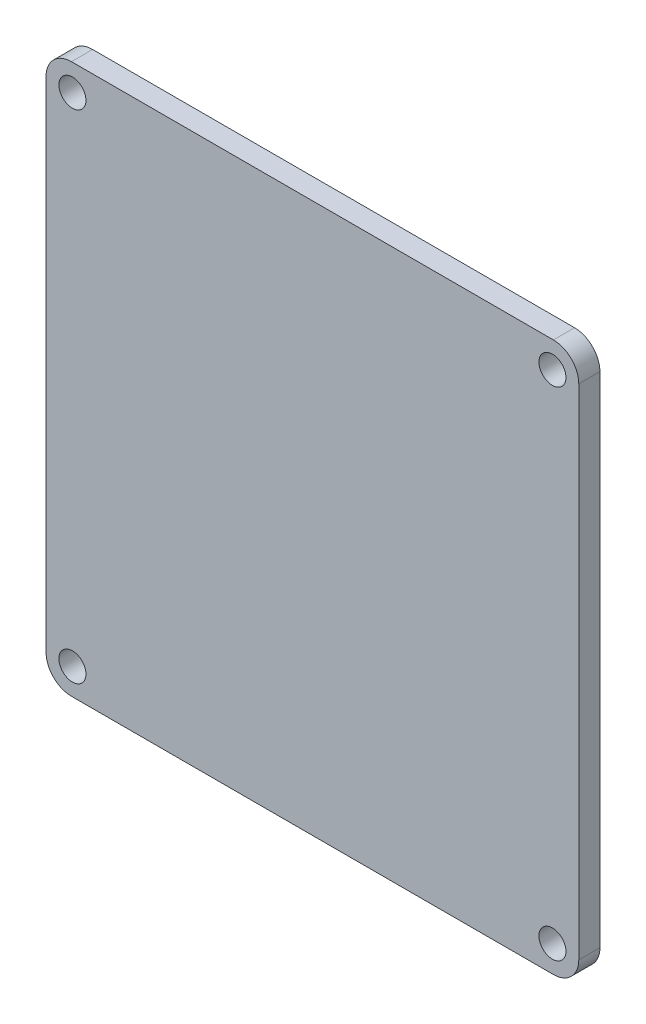
ISO-10303-21;
HEADER;
FILE_DESCRIPTION(('STEP AP214'),'2;1');
FILE_NAME('part.step','',(''),(''),'','','');
FILE_SCHEMA(('AUTOMOTIVE_DESIGN { 1 0 10303 214 1 1 1 1 }'));
ENDSEC;
DATA;
#1=APPLICATION_CONTEXT('core data for automotive mechanical design processes');
#2=APPLICATION_PROTOCOL_DEFINITION('international standard','automotive_design',2000,#1);
#3=PRODUCT_CONTEXT('',#1,'mechanical');
#4=PRODUCT('Part','Part','',(#3));
#5=PRODUCT_RELATED_PRODUCT_CATEGORY('part','',(#4));
#6=PRODUCT_DEFINITION_FORMATION('','',#4);
#7=PRODUCT_DEFINITION_CONTEXT('part definition',#1,'design');
#8=PRODUCT_DEFINITION('design','',#6,#7);
#9=PRODUCT_DEFINITION_SHAPE('','',#8);
#10=(LENGTH_UNIT() NAMED_UNIT(*) SI_UNIT(.MILLI.,.METRE.));
#11=(NAMED_UNIT(*) PLANE_ANGLE_UNIT() SI_UNIT($,.RADIAN.));
#12=(NAMED_UNIT(*) SI_UNIT($,.STERADIAN.) SOLID_ANGLE_UNIT());
#13=UNCERTAINTY_MEASURE_WITH_UNIT(LENGTH_MEASURE(1.E-05),#10,'distance_accuracy_value','');
#14=(GEOMETRIC_REPRESENTATION_CONTEXT(3) GLOBAL_UNCERTAINTY_ASSIGNED_CONTEXT((#13)) GLOBAL_UNIT_ASSIGNED_CONTEXT((#10,
#11,#12)) REPRESENTATION_CONTEXT('',''));
#15=CARTESIAN_POINT('',(0.,0.,0.));
#16=DIRECTION('',(0.,0.,1.));
#17=DIRECTION('',(1.,0.,0.));
#18=AXIS2_PLACEMENT_3D('',#15,#16,#17);
#19=CARTESIAN_POINT('',(0.,0.,2.5));
#20=DIRECTION('',(0.,1.,0.));
#21=DIRECTION('',(-1.,0.,0.));
#22=AXIS2_PLACEMENT_3D('',#19,#20,#21);
#23=PLANE('',#22);
#24=DIRECTION('',(1.,0.,0.));
#25=VECTOR('',#24,1.);
#26=CARTESIAN_POINT('',(0.,0.,2.5));
#27=LINE('',#26,#25);
#28=CARTESIAN_POINT('',(3.,0.,2.5));
#29=VERTEX_POINT('',#28);
#30=CARTESIAN_POINT('',(60.,0.,2.5));
#31=VERTEX_POINT('',#30);
#32=EDGE_CURVE('E152',#29,#31,#27,.T.);
#33=ORIENTED_EDGE('',*,*,#32,.F.);
#34=DIRECTION('',(0.,0.,-1.));
#35=VECTOR('',#34,1.);
#36=CARTESIAN_POINT('',(3.,0.,0.));
#37=LINE('',#36,#35);
#38=CARTESIAN_POINT('',(3.,0.,0.));
#39=VERTEX_POINT('',#38);
#40=EDGE_CURVE('E11',#29,#39,#37,.T.);
#41=ORIENTED_EDGE('',*,*,#40,.T.);
#42=DIRECTION('',(1.,0.,0.));
#43=VECTOR('',#42,1.);
#44=CARTESIAN_POINT('',(0.,0.,0.));
#45=LINE('',#44,#43);
#46=CARTESIAN_POINT('',(60.,0.,0.));
#47=VERTEX_POINT('',#46);
#48=EDGE_CURVE('E155',#39,#47,#45,.T.);
#49=ORIENTED_EDGE('',*,*,#48,.T.);
#50=DIRECTION('',(0.,0.,-1.));
#51=VECTOR('',#50,1.);
#52=CARTESIAN_POINT('',(60.,0.,2.5));
#53=LINE('',#52,#51);
#54=EDGE_CURVE('E41',#47,#31,#53,.F.);
#55=ORIENTED_EDGE('',*,*,#54,.T.);
#56=EDGE_LOOP('',(#33,#41,#49,#55));
#57=FACE_BOUND('',#56,.T.);
#58=ADVANCED_FACE('F33',(#57),#23,.F.);
#59=CARTESIAN_POINT('',(63.,0.,2.5));
#60=DIRECTION('',(-1.,0.,0.));
#61=DIRECTION('',(0.,0.,1.));
#62=AXIS2_PLACEMENT_3D('',#59,#60,#61);
#63=PLANE('',#62);
#64=DIRECTION('',(0.,1.,0.));
#65=VECTOR('',#64,1.);
#66=CARTESIAN_POINT('',(63.,0.,0.));
#67=LINE('',#66,#65);
#68=CARTESIAN_POINT('',(63.,3.00000000000001,0.));
#69=VERTEX_POINT('',#68);
#70=CARTESIAN_POINT('',(63.,62.,0.));
#71=VERTEX_POINT('',#70);
#72=EDGE_CURVE('E119',#69,#71,#67,.T.);
#73=ORIENTED_EDGE('',*,*,#72,.T.);
#74=DIRECTION('',(0.,0.,-1.));
#75=VECTOR('',#74,1.);
#76=CARTESIAN_POINT('',(63.,62.,2.5));
#77=LINE('',#76,#75);
#78=CARTESIAN_POINT('',(63.,62.,2.5));
#79=VERTEX_POINT('',#78);
#80=EDGE_CURVE('E136',#71,#79,#77,.F.);
#81=ORIENTED_EDGE('',*,*,#80,.T.);
#82=DIRECTION('',(0.,1.,0.));
#83=VECTOR('',#82,1.);
#84=CARTESIAN_POINT('',(63.,0.,2.5));
#85=LINE('',#84,#83);
#86=CARTESIAN_POINT('',(63.,3.00000000000001,2.5));
#87=VERTEX_POINT('',#86);
#88=EDGE_CURVE('E162',#87,#79,#85,.T.);
#89=ORIENTED_EDGE('',*,*,#88,.F.);
#90=DIRECTION('',(0.,0.,-1.));
#91=VECTOR('',#90,1.);
#92=CARTESIAN_POINT('',(63.,3.00000000000001,2.5));
#93=LINE('',#92,#91);
#94=EDGE_CURVE('E133',#87,#69,#93,.T.);
#95=ORIENTED_EDGE('',*,*,#94,.T.);
#96=EDGE_LOOP('',(#73,#81,#89,#95));
#97=FACE_BOUND('',#96,.T.);
#98=ADVANCED_FACE('F168',(#97),#63,.F.);
#99=CARTESIAN_POINT('',(0.,65.,2.5));
#100=DIRECTION('',(0.,1.,0.));
#101=DIRECTION('',(0.,0.,1.));
#102=AXIS2_PLACEMENT_3D('',#99,#100,#101);
#103=PLANE('',#102);
#104=DIRECTION('',(1.,0.,0.));
#105=VECTOR('',#104,1.);
#106=CARTESIAN_POINT('',(0.,65.,2.5));
#107=LINE('',#106,#105);
#108=CARTESIAN_POINT('',(3.00000000000002,65.,2.5));
#109=VERTEX_POINT('',#108);
#110=CARTESIAN_POINT('',(60.,65.,2.5));
#111=VERTEX_POINT('',#110);
#112=EDGE_CURVE('E126',#109,#111,#107,.T.);
#113=ORIENTED_EDGE('',*,*,#112,.T.);
#114=DIRECTION('',(0.,0.,-1.));
#115=VECTOR('',#114,1.);
#116=CARTESIAN_POINT('',(60.,65.,0.));
#117=LINE('',#116,#115);
#118=CARTESIAN_POINT('',(60.,65.,0.));
#119=VERTEX_POINT('',#118);
#120=EDGE_CURVE('E118',#111,#119,#117,.T.);
#121=ORIENTED_EDGE('',*,*,#120,.T.);
#122=DIRECTION('',(1.,0.,0.));
#123=VECTOR('',#122,1.);
#124=CARTESIAN_POINT('',(0.,65.,0.));
#125=LINE('',#124,#123);
#126=CARTESIAN_POINT('',(3.00000000000002,65.,0.));
#127=VERTEX_POINT('',#126);
#128=EDGE_CURVE('E103',#127,#119,#125,.T.);
#129=ORIENTED_EDGE('',*,*,#128,.F.);
#130=DIRECTION('',(0.,0.,-1.));
#131=VECTOR('',#130,1.);
#132=CARTESIAN_POINT('',(3.00000000000002,65.,2.5));
#133=LINE('',#132,#131);
#134=EDGE_CURVE('E116',#127,#109,#133,.F.);
#135=ORIENTED_EDGE('',*,*,#134,.T.);
#136=EDGE_LOOP('',(#113,#121,#129,#135));
#137=FACE_BOUND('',#136,.T.);
#138=ADVANCED_FACE('F115',(#137),#103,.T.);
#139=CARTESIAN_POINT('',(0.,0.,2.5));
#140=DIRECTION('',(-1.,0.,0.));
#141=DIRECTION('',(0.,-1.,0.));
#142=AXIS2_PLACEMENT_3D('',#139,#140,#141);
#143=PLANE('',#142);
#144=DIRECTION('',(0.,1.,0.));
#145=VECTOR('',#144,1.);
#146=CARTESIAN_POINT('',(0.,0.,2.5));
#147=LINE('',#146,#145);
#148=CARTESIAN_POINT('',(0.,3.,2.5));
#149=VERTEX_POINT('',#148);
#150=CARTESIAN_POINT('',(0.,62.,2.5));
#151=VERTEX_POINT('',#150);
#152=EDGE_CURVE('E122',#149,#151,#147,.T.);
#153=ORIENTED_EDGE('',*,*,#152,.T.);
#154=DIRECTION('',(0.,0.,-1.));
#155=VECTOR('',#154,1.);
#156=CARTESIAN_POINT('',(0.,62.,2.5));
#157=LINE('',#156,#155);
#158=CARTESIAN_POINT('',(0.,62.,0.));
#159=VERTEX_POINT('',#158);
#160=EDGE_CURVE('E146',#151,#159,#157,.T.);
#161=ORIENTED_EDGE('',*,*,#160,.T.);
#162=DIRECTION('',(0.,1.,0.));
#163=VECTOR('',#162,1.);
#164=CARTESIAN_POINT('',(0.,0.,0.));
#165=LINE('',#164,#163);
#166=CARTESIAN_POINT('',(0.,3.,0.));
#167=VERTEX_POINT('',#166);
#168=EDGE_CURVE('E104',#167,#159,#165,.T.);
#169=ORIENTED_EDGE('',*,*,#168,.F.);
#170=DIRECTION('',(0.,0.,-1.));
#171=VECTOR('',#170,1.);
#172=CARTESIAN_POINT('',(0.,3.,2.5));
#173=LINE('',#172,#171);
#174=EDGE_CURVE('E55',#167,#149,#173,.F.);
#175=ORIENTED_EDGE('',*,*,#174,.T.);
#176=EDGE_LOOP('',(#153,#161,#169,#175));
#177=FACE_BOUND('',#176,.T.);
#178=ADVANCED_FACE('F236',(#177),#143,.T.);
#179=CARTESIAN_POINT('',(0.,0.,2.5));
#180=DIRECTION('',(0.,0.,1.));
#181=DIRECTION('',(1.,0.,0.));
#182=AXIS2_PLACEMENT_3D('',#179,#180,#181);
#183=PLANE('',#182);
#184=CARTESIAN_POINT('',(59.8844963488532,61.8844963488532,2.5));
#185=DIRECTION('',(0.,0.,1.));
#186=DIRECTION('',(1.,0.,0.));
#187=AXIS2_PLACEMENT_3D('',#184,#185,#186);
#188=CIRCLE('',#187,1.6);
#189=CARTESIAN_POINT('',(61.4844963488532,61.8844963488532,2.5));
#190=VERTEX_POINT('',#189);
#191=EDGE_CURVE('E182',#190,#190,#188,.T.);
#192=ORIENTED_EDGE('',*,*,#191,.F.);
#193=EDGE_LOOP('',(#192));
#194=FACE_BOUND('',#193,.T.);
#195=CARTESIAN_POINT('',(59.8844963488532,3.1155036511468,2.5));
#196=DIRECTION('',(0.,0.,1.));
#197=DIRECTION('',(1.,0.,0.));
#198=AXIS2_PLACEMENT_3D('',#195,#196,#197);
#199=CIRCLE('',#198,1.6);
#200=CARTESIAN_POINT('',(61.4844963488532,3.1155036511468,2.5));
#201=VERTEX_POINT('',#200);
#202=EDGE_CURVE('E188',#201,#201,#199,.T.);
#203=ORIENTED_EDGE('',*,*,#202,.F.);
#204=EDGE_LOOP('',(#203));
#205=FACE_BOUND('',#204,.T.);
#206=CARTESIAN_POINT('',(3.1155036511468,3.1155036511468,2.5));
#207=DIRECTION('',(0.,0.,1.));
#208=DIRECTION('',(1.,0.,0.));
#209=AXIS2_PLACEMENT_3D('',#206,#207,#208);
#210=CIRCLE('',#209,1.6);
#211=CARTESIAN_POINT('',(4.7155036511468,3.1155036511468,2.5));
#212=VERTEX_POINT('',#211);
#213=EDGE_CURVE('E194',#212,#212,#210,.T.);
#214=ORIENTED_EDGE('',*,*,#213,.F.);
#215=EDGE_LOOP('',(#214));
#216=FACE_BOUND('',#215,.T.);
#217=CARTESIAN_POINT('',(3.1155036511468,61.8844963488532,2.5));
#218=DIRECTION('',(0.,0.,1.));
#219=DIRECTION('',(1.,0.,0.));
#220=AXIS2_PLACEMENT_3D('',#217,#218,#219);
#221=CIRCLE('',#220,1.6);
#222=CARTESIAN_POINT('',(4.7155036511468,61.8844963488532,2.5));
#223=VERTEX_POINT('',#222);
#224=EDGE_CURVE('E171',#223,#223,#221,.T.);
#225=ORIENTED_EDGE('',*,*,#224,.F.);
#226=EDGE_LOOP('',(#225));
#227=FACE_BOUND('',#226,.T.);
#228=ORIENTED_EDGE('',*,*,#88,.T.);
#229=CARTESIAN_POINT('',(60.,62.,2.5));
#230=DIRECTION('',(0.,0.,1.));
#231=DIRECTION('',(1.,0.,0.));
#232=AXIS2_PLACEMENT_3D('',#229,#230,#231);
#233=CIRCLE('',#232,3.);
#234=EDGE_CURVE('E143',#79,#111,#233,.T.);
#235=ORIENTED_EDGE('',*,*,#234,.T.);
#236=ORIENTED_EDGE('',*,*,#112,.F.);
#237=CARTESIAN_POINT('',(3.00000000000002,62.,2.5));
#238=DIRECTION('',(0.,0.,1.));
#239=DIRECTION('',(1.,0.,0.));
#240=AXIS2_PLACEMENT_3D('',#237,#238,#239);
#241=CIRCLE('',#240,3.);
#242=EDGE_CURVE('E48',#109,#151,#241,.T.);
#243=ORIENTED_EDGE('',*,*,#242,.T.);
#244=ORIENTED_EDGE('',*,*,#152,.F.);
#245=CARTESIAN_POINT('',(3.,3.,2.5));
#246=DIRECTION('',(0.,0.,1.));
#247=DIRECTION('',(1.,0.,0.));
#248=AXIS2_PLACEMENT_3D('',#245,#246,#247);
#249=CIRCLE('',#248,3.);
#250=EDGE_CURVE('E140',#149,#29,#249,.T.);
#251=ORIENTED_EDGE('',*,*,#250,.T.);
#252=ORIENTED_EDGE('',*,*,#32,.T.);
#253=CARTESIAN_POINT('',(60.,3.00000000000001,2.5));
#254=DIRECTION('',(0.,0.,1.));
#255=DIRECTION('',(1.,0.,0.));
#256=AXIS2_PLACEMENT_3D('',#253,#254,#255);
#257=CIRCLE('',#256,3.);
#258=EDGE_CURVE('E138',#31,#87,#257,.T.);
#259=ORIENTED_EDGE('',*,*,#258,.T.);
#260=EDGE_LOOP('',(#228,#235,#236,#243,#244,#251,#252,#259));
#261=FACE_BOUND('',#260,.T.);
#262=ADVANCED_FACE('F159',(#194,#205,#216,#227,#261),#183,.T.);
#263=CARTESIAN_POINT('',(0.,0.,0.));
#264=DIRECTION('',(0.,0.,1.));
#265=DIRECTION('',(1.,0.,0.));
#266=AXIS2_PLACEMENT_3D('',#263,#264,#265);
#267=PLANE('',#266);
#268=CARTESIAN_POINT('',(59.8844963488532,61.8844963488532,0.));
#269=DIRECTION('',(0.,0.,1.));
#270=DIRECTION('',(1.,0.,0.));
#271=AXIS2_PLACEMENT_3D('',#268,#269,#270);
#272=CIRCLE('',#271,1.6);
#273=CARTESIAN_POINT('',(61.4844963488532,61.8844963488532,0.));
#274=VERTEX_POINT('',#273);
#275=EDGE_CURVE('E185',#274,#274,#272,.T.);
#276=ORIENTED_EDGE('',*,*,#275,.T.);
#277=EDGE_LOOP('',(#276));
#278=FACE_BOUND('',#277,.T.);
#279=CARTESIAN_POINT('',(59.8844963488532,3.1155036511468,0.));
#280=DIRECTION('',(0.,0.,1.));
#281=DIRECTION('',(1.,0.,0.));
#282=AXIS2_PLACEMENT_3D('',#279,#280,#281);
#283=CIRCLE('',#282,1.6);
#284=CARTESIAN_POINT('',(61.4844963488532,3.1155036511468,0.));
#285=VERTEX_POINT('',#284);
#286=EDGE_CURVE('E191',#285,#285,#283,.T.);
#287=ORIENTED_EDGE('',*,*,#286,.T.);
#288=EDGE_LOOP('',(#287));
#289=FACE_BOUND('',#288,.T.);
#290=CARTESIAN_POINT('',(3.1155036511468,3.1155036511468,0.));
#291=DIRECTION('',(0.,0.,1.));
#292=DIRECTION('',(1.,0.,0.));
#293=AXIS2_PLACEMENT_3D('',#290,#291,#292);
#294=CIRCLE('',#293,1.6);
#295=CARTESIAN_POINT('',(4.7155036511468,3.1155036511468,0.));
#296=VERTEX_POINT('',#295);
#297=EDGE_CURVE('E179',#296,#296,#294,.T.);
#298=ORIENTED_EDGE('',*,*,#297,.T.);
#299=EDGE_LOOP('',(#298));
#300=FACE_BOUND('',#299,.T.);
#301=CARTESIAN_POINT('',(3.1155036511468,61.8844963488532,0.));
#302=DIRECTION('',(0.,0.,1.));
#303=DIRECTION('',(1.,0.,0.));
#304=AXIS2_PLACEMENT_3D('',#301,#302,#303);
#305=CIRCLE('',#304,1.6);
#306=CARTESIAN_POINT('',(4.7155036511468,61.8844963488532,0.));
#307=VERTEX_POINT('',#306);
#308=EDGE_CURVE('E176',#307,#307,#305,.T.);
#309=ORIENTED_EDGE('',*,*,#308,.T.);
#310=EDGE_LOOP('',(#309));
#311=FACE_BOUND('',#310,.T.);
#312=ORIENTED_EDGE('',*,*,#128,.T.);
#313=CARTESIAN_POINT('',(60.,62.,0.));
#314=DIRECTION('',(0.,0.,1.));
#315=DIRECTION('',(1.,0.,0.));
#316=AXIS2_PLACEMENT_3D('',#313,#314,#315);
#317=CIRCLE('',#316,3.);
#318=EDGE_CURVE('E109',#119,#71,#317,.F.);
#319=ORIENTED_EDGE('',*,*,#318,.T.);
#320=ORIENTED_EDGE('',*,*,#72,.F.);
#321=CARTESIAN_POINT('',(60.,3.00000000000001,0.));
#322=DIRECTION('',(0.,0.,1.));
#323=DIRECTION('',(1.,0.,0.));
#324=AXIS2_PLACEMENT_3D('',#321,#322,#323);
#325=CIRCLE('',#324,3.);
#326=EDGE_CURVE('E124',#69,#47,#325,.F.);
#327=ORIENTED_EDGE('',*,*,#326,.T.);
#328=ORIENTED_EDGE('',*,*,#48,.F.);
#329=CARTESIAN_POINT('',(3.,3.,0.));
#330=DIRECTION('',(0.,0.,1.));
#331=DIRECTION('',(1.,0.,0.));
#332=AXIS2_PLACEMENT_3D('',#329,#330,#331);
#333=CIRCLE('',#332,3.);
#334=EDGE_CURVE('E110',#39,#167,#333,.F.);
#335=ORIENTED_EDGE('',*,*,#334,.T.);
#336=ORIENTED_EDGE('',*,*,#168,.T.);
#337=CARTESIAN_POINT('',(3.00000000000002,62.,0.));
#338=DIRECTION('',(0.,0.,1.));
#339=DIRECTION('',(1.,0.,0.));
#340=AXIS2_PLACEMENT_3D('',#337,#338,#339);
#341=CIRCLE('',#340,3.);
#342=EDGE_CURVE('E100',#159,#127,#341,.F.);
#343=ORIENTED_EDGE('',*,*,#342,.T.);
#344=EDGE_LOOP('',(#312,#319,#320,#327,#328,#335,#336,#343));
#345=FACE_BOUND('',#344,.T.);
#346=ADVANCED_FACE('F102',(#278,#289,#300,#311,#345),#267,.F.);
#347=CARTESIAN_POINT('',(60.,62.,2.5));
#348=DIRECTION('',(0.,0.,1.));
#349=DIRECTION('',(1.,0.,0.));
#350=AXIS2_PLACEMENT_3D('',#347,#348,#349);
#351=CYLINDRICAL_SURFACE('',#350,3.);
#352=ORIENTED_EDGE('',*,*,#234,.F.);
#353=ORIENTED_EDGE('',*,*,#80,.F.);
#354=ORIENTED_EDGE('',*,*,#318,.F.);
#355=ORIENTED_EDGE('',*,*,#120,.F.);
#356=EDGE_LOOP('',(#352,#353,#354,#355));
#357=FACE_BOUND('',#356,.T.);
#358=ADVANCED_FACE('F225',(#357),#351,.T.);
#359=CARTESIAN_POINT('',(3.00000000000002,62.,2.5));
#360=DIRECTION('',(0.,0.,-1.));
#361=DIRECTION('',(-1.,0.,0.));
#362=AXIS2_PLACEMENT_3D('',#359,#360,#361);
#363=CYLINDRICAL_SURFACE('',#362,3.);
#364=ORIENTED_EDGE('',*,*,#242,.F.);
#365=ORIENTED_EDGE('',*,*,#134,.F.);
#366=ORIENTED_EDGE('',*,*,#342,.F.);
#367=ORIENTED_EDGE('',*,*,#160,.F.);
#368=EDGE_LOOP('',(#364,#365,#366,#367));
#369=FACE_BOUND('',#368,.T.);
#370=ADVANCED_FACE('F121',(#369),#363,.T.);
#371=CARTESIAN_POINT('',(3.,3.,2.5));
#372=DIRECTION('',(0.,0.,1.));
#373=DIRECTION('',(1.,0.,0.));
#374=AXIS2_PLACEMENT_3D('',#371,#372,#373);
#375=CYLINDRICAL_SURFACE('',#374,3.);
#376=ORIENTED_EDGE('',*,*,#250,.F.);
#377=ORIENTED_EDGE('',*,*,#174,.F.);
#378=ORIENTED_EDGE('',*,*,#334,.F.);
#379=ORIENTED_EDGE('',*,*,#40,.F.);
#380=EDGE_LOOP('',(#376,#377,#378,#379));
#381=FACE_BOUND('',#380,.T.);
#382=ADVANCED_FACE('F230',(#381),#375,.T.);
#383=CARTESIAN_POINT('',(60.,3.00000000000001,2.5));
#384=DIRECTION('',(0.,0.,-1.));
#385=DIRECTION('',(-1.,0.,0.));
#386=AXIS2_PLACEMENT_3D('',#383,#384,#385);
#387=CYLINDRICAL_SURFACE('',#386,3.);
#388=ORIENTED_EDGE('',*,*,#258,.F.);
#389=ORIENTED_EDGE('',*,*,#54,.F.);
#390=ORIENTED_EDGE('',*,*,#326,.F.);
#391=ORIENTED_EDGE('',*,*,#94,.F.);
#392=EDGE_LOOP('',(#388,#389,#390,#391));
#393=FACE_BOUND('',#392,.T.);
#394=ADVANCED_FACE('F35',(#393),#387,.T.);
#395=CARTESIAN_POINT('',(3.1155036511468,61.8844963488532,2.5));
#396=DIRECTION('',(0.,0.,-1.));
#397=DIRECTION('',(-1.,0.,0.));
#398=AXIS2_PLACEMENT_3D('',#395,#396,#397);
#399=CYLINDRICAL_SURFACE('',#398,1.6);
#400=ORIENTED_EDGE('',*,*,#224,.T.);
#401=EDGE_LOOP('',(#400));
#402=FACE_BOUND('',#401,.T.);
#403=ORIENTED_EDGE('',*,*,#308,.F.);
#404=EDGE_LOOP('',(#403));
#405=FACE_BOUND('',#404,.T.);
#406=ADVANCED_FACE('F205',(#402,#405),#399,.F.);
#407=CARTESIAN_POINT('',(3.1155036511468,3.1155036511468,2.5));
#408=DIRECTION('',(0.,0.,-1.));
#409=DIRECTION('',(-1.,0.,0.));
#410=AXIS2_PLACEMENT_3D('',#407,#408,#409);
#411=CYLINDRICAL_SURFACE('',#410,1.6);
#412=ORIENTED_EDGE('',*,*,#213,.T.);
#413=EDGE_LOOP('',(#412));
#414=FACE_BOUND('',#413,.T.);
#415=ORIENTED_EDGE('',*,*,#297,.F.);
#416=EDGE_LOOP('',(#415));
#417=FACE_BOUND('',#416,.T.);
#418=ADVANCED_FACE('F202',(#414,#417),#411,.F.);
#419=CARTESIAN_POINT('',(59.8844963488532,3.1155036511468,2.5));
#420=DIRECTION('',(0.,0.,-1.));
#421=DIRECTION('',(-1.,0.,0.));
#422=AXIS2_PLACEMENT_3D('',#419,#420,#421);
#423=CYLINDRICAL_SURFACE('',#422,1.6);
#424=ORIENTED_EDGE('',*,*,#202,.T.);
#425=EDGE_LOOP('',(#424));
#426=FACE_BOUND('',#425,.T.);
#427=ORIENTED_EDGE('',*,*,#286,.F.);
#428=EDGE_LOOP('',(#427));
#429=FACE_BOUND('',#428,.T.);
#430=ADVANCED_FACE('F204',(#426,#429),#423,.F.);
#431=CARTESIAN_POINT('',(59.8844963488532,61.8844963488532,2.5));
#432=DIRECTION('',(0.,0.,-1.));
#433=DIRECTION('',(-1.,0.,0.));
#434=AXIS2_PLACEMENT_3D('',#431,#432,#433);
#435=CYLINDRICAL_SURFACE('',#434,1.6);
#436=ORIENTED_EDGE('',*,*,#191,.T.);
#437=EDGE_LOOP('',(#436));
#438=FACE_BOUND('',#437,.T.);
#439=ORIENTED_EDGE('',*,*,#275,.F.);
#440=EDGE_LOOP('',(#439));
#441=FACE_BOUND('',#440,.T.);
#442=ADVANCED_FACE('F212',(#438,#441),#435,.F.);
#443=CLOSED_SHELL('',(#58,#98,#138,#178,#262,#346,#358,#370,#382,#394,#406,#418,#430,#442));
#444=MANIFOLD_SOLID_BREP('B2',#443);
#445=ADVANCED_BREP_SHAPE_REPRESENTATION('',(#18,#444),#14);
#446=SHAPE_DEFINITION_REPRESENTATION(#9,#445);
ENDSEC;
END-ISO-10303-21;
